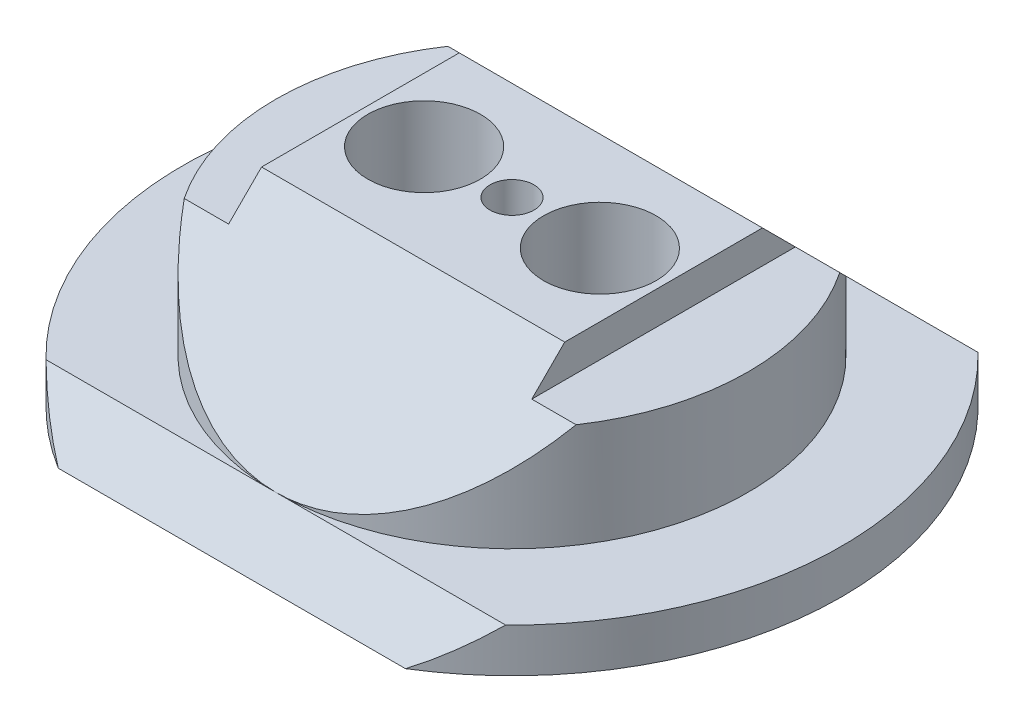
ISO-10303-21;
HEADER;
FILE_DESCRIPTION(('STEP AP214'),'2;1');
FILE_NAME('part.step','',(''),(''),'','','');
FILE_SCHEMA(('AUTOMOTIVE_DESIGN { 1 0 10303 214 1 1 1 1 }'));
ENDSEC;
DATA;
#1=APPLICATION_CONTEXT('core data for automotive mechanical design processes');
#2=APPLICATION_PROTOCOL_DEFINITION('international standard','automotive_design',2000,#1);
#3=PRODUCT_CONTEXT('',#1,'mechanical');
#4=PRODUCT('Part','Part','',(#3));
#5=PRODUCT_RELATED_PRODUCT_CATEGORY('part','',(#4));
#6=PRODUCT_DEFINITION_FORMATION('','',#4);
#7=PRODUCT_DEFINITION_CONTEXT('part definition',#1,'design');
#8=PRODUCT_DEFINITION('design','',#6,#7);
#9=PRODUCT_DEFINITION_SHAPE('','',#8);
#10=(LENGTH_UNIT() NAMED_UNIT(*) SI_UNIT(.MILLI.,.METRE.));
#11=(NAMED_UNIT(*) PLANE_ANGLE_UNIT() SI_UNIT($,.RADIAN.));
#12=(NAMED_UNIT(*) SI_UNIT($,.STERADIAN.) SOLID_ANGLE_UNIT());
#13=UNCERTAINTY_MEASURE_WITH_UNIT(LENGTH_MEASURE(1.E-05),#10,'distance_accuracy_value','');
#14=(GEOMETRIC_REPRESENTATION_CONTEXT(3) GLOBAL_UNCERTAINTY_ASSIGNED_CONTEXT((#13)) GLOBAL_UNIT_ASSIGNED_CONTEXT((#10,
#11,#12)) REPRESENTATION_CONTEXT('',''));
#15=CARTESIAN_POINT('',(0.,0.,0.));
#16=DIRECTION('',(0.,0.,1.));
#17=DIRECTION('',(1.,0.,0.));
#18=AXIS2_PLACEMENT_3D('',#15,#16,#17);
#19=CARTESIAN_POINT('',(0.,20.,0.));
#20=DIRECTION('',(0.,-1.,0.));
#21=DIRECTION('',(0.,0.,-1.));
#22=AXIS2_PLACEMENT_3D('',#19,#20,#21);
#23=CYLINDRICAL_SURFACE('',#22,1.375);
#24=CARTESIAN_POINT('',(0.,0.,0.));
#25=DIRECTION('',(0.,-1.,0.));
#26=DIRECTION('',(0.,0.,-1.));
#27=AXIS2_PLACEMENT_3D('',#24,#25,#26);
#28=CIRCLE('',#27,1.375);
#29=CARTESIAN_POINT('',(0.,0.,-1.375));
#30=VERTEX_POINT('',#29);
#31=EDGE_CURVE('E159',#30,#30,#28,.T.);
#32=ORIENTED_EDGE('',*,*,#31,.T.);
#33=EDGE_LOOP('',(#32));
#34=FACE_BOUND('',#33,.T.);
#35=CARTESIAN_POINT('',(0.,10.5,0.));
#36=DIRECTION('',(0.,1.,0.));
#37=DIRECTION('',(0.,0.,1.));
#38=AXIS2_PLACEMENT_3D('',#35,#36,#37);
#39=CIRCLE('',#38,1.375);
#40=CARTESIAN_POINT('',(0.,10.5,1.375));
#41=VERTEX_POINT('',#40);
#42=EDGE_CURVE('E63',#41,#41,#39,.F.);
#43=ORIENTED_EDGE('',*,*,#42,.F.);
#44=EDGE_LOOP('',(#43));
#45=FACE_BOUND('',#44,.T.);
#46=ADVANCED_FACE('F59',(#34,#45),#23,.F.);
#47=CARTESIAN_POINT('',(0.,0.,0.));
#48=DIRECTION('',(0.,1.,0.));
#49=DIRECTION('',(0.,0.,1.));
#50=AXIS2_PLACEMENT_3D('',#47,#48,#49);
#51=PLANE('',#50);
#52=CARTESIAN_POINT('',(-14.,0.,12.));
#53=DIRECTION('',(0.,-1.,0.));
#54=DIRECTION('',(0.,0.,-1.));
#55=AXIS2_PLACEMENT_3D('',#52,#53,#54);
#56=CIRCLE('',#55,5.);
#57=CARTESIAN_POINT('',(-14.,0.,7.));
#58=VERTEX_POINT('',#57);
#59=EDGE_CURVE('E628',#58,#58,#56,.T.);
#60=ORIENTED_EDGE('',*,*,#59,.F.);
#61=EDGE_LOOP('',(#60));
#62=FACE_BOUND('',#61,.T.);
#63=CARTESIAN_POINT('',(22.,0.,0.));
#64=DIRECTION('',(0.,-1.,0.));
#65=DIRECTION('',(0.,0.,-1.));
#66=AXIS2_PLACEMENT_3D('',#63,#64,#65);
#67=CIRCLE('',#66,5.);
#68=CARTESIAN_POINT('',(22.,0.,-5.));
#69=VERTEX_POINT('',#68);
#70=EDGE_CURVE('E627',#69,#69,#67,.T.);
#71=ORIENTED_EDGE('',*,*,#70,.F.);
#72=EDGE_LOOP('',(#71));
#73=FACE_BOUND('',#72,.T.);
#74=CARTESIAN_POINT('',(-22.,0.,0.));
#75=DIRECTION('',(0.,-1.,0.));
#76=DIRECTION('',(0.,0.,-1.));
#77=AXIS2_PLACEMENT_3D('',#74,#75,#76);
#78=CIRCLE('',#77,5.);
#79=CARTESIAN_POINT('',(-22.,0.,-5.));
#80=VERTEX_POINT('',#79);
#81=EDGE_CURVE('E653',#80,#80,#78,.T.);
#82=ORIENTED_EDGE('',*,*,#81,.F.);
#83=EDGE_LOOP('',(#82));
#84=FACE_BOUND('',#83,.T.);
#85=CARTESIAN_POINT('',(0.,0.,15.));
#86=DIRECTION('',(0.,-1.,0.));
#87=DIRECTION('',(0.,0.,-1.));
#88=AXIS2_PLACEMENT_3D('',#85,#86,#87);
#89=CIRCLE('',#88,5.);
#90=CARTESIAN_POINT('',(0.,0.,10.));
#91=VERTEX_POINT('',#90);
#92=EDGE_CURVE('E645',#91,#91,#89,.T.);
#93=ORIENTED_EDGE('',*,*,#92,.F.);
#94=EDGE_LOOP('',(#93));
#95=FACE_BOUND('',#94,.T.);
#96=CARTESIAN_POINT('',(14.,0.,-12.));
#97=DIRECTION('',(0.,-1.,0.));
#98=DIRECTION('',(0.,0.,-1.));
#99=AXIS2_PLACEMENT_3D('',#96,#97,#98);
#100=CIRCLE('',#99,5.);
#101=CARTESIAN_POINT('',(14.,0.,-17.));
#102=VERTEX_POINT('',#101);
#103=EDGE_CURVE('E700',#102,#102,#100,.T.);
#104=ORIENTED_EDGE('',*,*,#103,.F.);
#105=EDGE_LOOP('',(#104));
#106=FACE_BOUND('',#105,.T.);
#107=CARTESIAN_POINT('',(-14.,0.,-12.));
#108=DIRECTION('',(0.,-1.,0.));
#109=DIRECTION('',(0.,0.,-1.));
#110=AXIS2_PLACEMENT_3D('',#107,#108,#109);
#111=CIRCLE('',#110,5.);
#112=CARTESIAN_POINT('',(-14.,0.,-17.));
#113=VERTEX_POINT('',#112);
#114=EDGE_CURVE('E684',#113,#113,#111,.T.);
#115=ORIENTED_EDGE('',*,*,#114,.F.);
#116=EDGE_LOOP('',(#115));
#117=FACE_BOUND('',#116,.T.);
#118=CARTESIAN_POINT('',(14.,0.,12.));
#119=DIRECTION('',(0.,-1.,0.));
#120=DIRECTION('',(0.,0.,-1.));
#121=AXIS2_PLACEMENT_3D('',#118,#119,#120);
#122=CIRCLE('',#121,5.);
#123=CARTESIAN_POINT('',(14.,0.,7.));
#124=VERTEX_POINT('',#123);
#125=EDGE_CURVE('E693',#124,#124,#122,.T.);
#126=ORIENTED_EDGE('',*,*,#125,.F.);
#127=EDGE_LOOP('',(#126));
#128=FACE_BOUND('',#127,.T.);
#129=CARTESIAN_POINT('',(0.,0.,-15.));
#130=DIRECTION('',(0.,-1.,0.));
#131=DIRECTION('',(0.,0.,-1.));
#132=AXIS2_PLACEMENT_3D('',#129,#130,#131);
#133=CIRCLE('',#132,5.);
#134=CARTESIAN_POINT('',(0.,0.,-20.));
#135=VERTEX_POINT('',#134);
#136=EDGE_CURVE('E644',#135,#135,#133,.T.);
#137=ORIENTED_EDGE('',*,*,#136,.F.);
#138=EDGE_LOOP('',(#137));
#139=FACE_BOUND('',#138,.T.);
#140=ORIENTED_EDGE('',*,*,#31,.F.);
#141=EDGE_LOOP('',(#140));
#142=FACE_BOUND('',#141,.T.);
#143=CARTESIAN_POINT('',(-8.,0.,0.));
#144=DIRECTION('',(0.,1.,0.));
#145=DIRECTION('',(0.,0.,1.));
#146=AXIS2_PLACEMENT_3D('',#143,#144,#145);
#147=CIRCLE('',#146,5.125);
#148=CARTESIAN_POINT('',(-8.,0.,5.125));
#149=VERTEX_POINT('',#148);
#150=EDGE_CURVE('E199',#149,#149,#147,.T.);
#151=ORIENTED_EDGE('',*,*,#150,.T.);
#152=EDGE_LOOP('',(#151));
#153=FACE_BOUND('',#152,.T.);
#154=CARTESIAN_POINT('',(8.,0.,0.));
#155=DIRECTION('',(0.,1.,0.));
#156=DIRECTION('',(0.,0.,1.));
#157=AXIS2_PLACEMENT_3D('',#154,#155,#156);
#158=CIRCLE('',#157,5.125);
#159=CARTESIAN_POINT('',(8.,0.,5.125));
#160=VERTEX_POINT('',#159);
#161=EDGE_CURVE('E192',#160,#160,#158,.T.);
#162=ORIENTED_EDGE('',*,*,#161,.T.);
#163=EDGE_LOOP('',(#162));
#164=FACE_BOUND('',#163,.T.);
#165=DIRECTION('',(1.,0.,0.));
#166=VECTOR('',#165,1.);
#167=CARTESIAN_POINT('',(0.,0.,25.5));
#168=LINE('',#167,#166);
#169=CARTESIAN_POINT('',(-15.8034806292791,0.,25.5));
#170=VERTEX_POINT('',#169);
#171=CARTESIAN_POINT('',(15.8034806292791,0.,25.5));
#172=VERTEX_POINT('',#171);
#173=EDGE_CURVE('E222',#170,#172,#168,.T.);
#174=ORIENTED_EDGE('',*,*,#173,.F.);
#175=CARTESIAN_POINT('',(0.,0.,0.));
#176=DIRECTION('',(0.,1.,0.));
#177=DIRECTION('',(0.,0.,1.));
#178=AXIS2_PLACEMENT_3D('',#175,#176,#177);
#179=CIRCLE('',#178,30.);
#180=CARTESIAN_POINT('',(-15.8034806292789,0.,-25.5000000000001));
#181=VERTEX_POINT('',#180);
#182=EDGE_CURVE('E252',#181,#170,#179,.T.);
#183=ORIENTED_EDGE('',*,*,#182,.F.);
#184=DIRECTION('',(-1.,0.,0.));
#185=VECTOR('',#184,1.);
#186=CARTESIAN_POINT('',(0.,0.,-25.5000000000001));
#187=LINE('',#186,#185);
#188=CARTESIAN_POINT('',(15.8034806292789,0.,-25.5000000000001));
#189=VERTEX_POINT('',#188);
#190=EDGE_CURVE('E226',#189,#181,#187,.T.);
#191=ORIENTED_EDGE('',*,*,#190,.F.);
#192=EDGE_CURVE('E241',#172,#189,#179,.T.);
#193=ORIENTED_EDGE('',*,*,#192,.F.);
#194=EDGE_LOOP('',(#174,#183,#191,#193));
#195=FACE_BOUND('',#194,.T.);
#196=ADVANCED_FACE('F309',(#62,#73,#84,#95,#106,#117,#128,#139,#142,#153,#164,#195),#51,.F.);
#197=CARTESIAN_POINT('',(0.,4.,0.));
#198=DIRECTION('',(0.,-1.,0.));
#199=DIRECTION('',(0.,0.,-1.));
#200=AXIS2_PLACEMENT_3D('',#197,#198,#199);
#201=CYLINDRICAL_SURFACE('',#200,30.);
#202=CARTESIAN_POINT('',(0.,4.,0.));
#203=DIRECTION('',(0.,1.,0.));
#204=DIRECTION('',(0.,0.,1.));
#205=AXIS2_PLACEMENT_3D('',#202,#203,#204);
#206=CIRCLE('',#205,30.);
#207=CARTESIAN_POINT('',(20.9224759529077,4.,21.5));
#208=VERTEX_POINT('',#207);
#209=CARTESIAN_POINT('',(20.9224759529077,4.,-21.5));
#210=VERTEX_POINT('',#209);
#211=EDGE_CURVE('E215',#208,#210,#206,.T.);
#212=ORIENTED_EDGE('',*,*,#211,.F.);
#213=CARTESIAN_POINT('',(0.,25.4999999999998,0.));
#214=DIRECTION('',(0.,-0.707106781186551,-0.707106781186544));
#215=DIRECTION('',(0.,-0.707106781186544,0.707106781186551));
#216=AXIS2_PLACEMENT_3D('',#213,#214,#215);
#217=ELLIPSE('',#216,42.4264068711926,30.);
#218=EDGE_CURVE('E242',#172,#208,#217,.F.);
#219=ORIENTED_EDGE('',*,*,#218,.F.);
#220=ORIENTED_EDGE('',*,*,#192,.T.);
#221=CARTESIAN_POINT('',(0.,25.4999999999995,0.));
#222=DIRECTION('',(0.,-0.707106781186556,0.707106781186539));
#223=DIRECTION('',(0.,-0.707106781186539,-0.707106781186556));
#224=AXIS2_PLACEMENT_3D('',#221,#222,#223);
#225=ELLIPSE('',#224,42.4264068711924,30.);
#226=EDGE_CURVE('E238',#210,#189,#225,.F.);
#227=ORIENTED_EDGE('',*,*,#226,.F.);
#228=EDGE_LOOP('',(#212,#219,#220,#227));
#229=FACE_BOUND('',#228,.T.);
#230=ADVANCED_FACE('F61',(#229),#201,.T.);
#231=CARTESIAN_POINT('',(0.,4.,0.));
#232=DIRECTION('',(0.,1.,0.));
#233=DIRECTION('',(0.,0.,1.));
#234=AXIS2_PLACEMENT_3D('',#231,#232,#233);
#235=CIRCLE('',#234,30.);
#236=CARTESIAN_POINT('',(-20.9224759529077,4.,-21.5));
#237=VERTEX_POINT('',#236);
#238=CARTESIAN_POINT('',(-20.9224759529077,4.,21.5));
#239=VERTEX_POINT('',#238);
#240=EDGE_CURVE('E212',#237,#239,#235,.T.);
#241=ORIENTED_EDGE('',*,*,#240,.F.);
#242=CARTESIAN_POINT('',(0.,25.4999999999995,0.));
#243=DIRECTION('',(0.,0.707106781186556,-0.707106781186539));
#244=DIRECTION('',(0.,-0.707106781186539,-0.707106781186556));
#245=AXIS2_PLACEMENT_3D('',#242,#243,#244);
#246=ELLIPSE('',#245,42.4264068711924,30.);
#247=EDGE_CURVE('E230',#237,#181,#246,.F.);
#248=ORIENTED_EDGE('',*,*,#247,.T.);
#249=ORIENTED_EDGE('',*,*,#182,.T.);
#250=CARTESIAN_POINT('',(0.,25.4999999999998,0.));
#251=DIRECTION('',(0.,0.707106781186551,0.707106781186544));
#252=DIRECTION('',(0.,-0.707106781186544,0.707106781186551));
#253=AXIS2_PLACEMENT_3D('',#250,#251,#252);
#254=ELLIPSE('',#253,42.4264068711926,30.);
#255=EDGE_CURVE('E233',#170,#239,#254,.F.);
#256=ORIENTED_EDGE('',*,*,#255,.T.);
#257=EDGE_LOOP('',(#241,#248,#249,#256));
#258=FACE_BOUND('',#257,.T.);
#259=ADVANCED_FACE('F318',(#258),#201,.T.);
#260=CARTESIAN_POINT('',(30.001,16.5,8.99999999999987));
#261=DIRECTION('',(0.,-0.707106781186551,-0.707106781186544));
#262=DIRECTION('',(0.,0.707106781186544,-0.707106781186551));
#263=AXIS2_PLACEMENT_3D('',#260,#261,#262);
#264=PLANE('',#263);
#265=DIRECTION('',(1.,0.,0.));
#266=VECTOR('',#265,1.);
#267=CARTESIAN_POINT('',(30.001,4.,21.5));
#268=LINE('',#267,#266);
#269=CARTESIAN_POINT('',(0.,3.99999999999999,21.5));
#270=VERTEX_POINT('',#269);
#271=EDGE_CURVE('E221',#239,#270,#268,.T.);
#272=ORIENTED_EDGE('',*,*,#271,.F.);
#273=ORIENTED_EDGE('',*,*,#255,.F.);
#274=ORIENTED_EDGE('',*,*,#173,.T.);
#275=ORIENTED_EDGE('',*,*,#218,.T.);
#276=EDGE_CURVE('E218',#270,#208,#268,.T.);
#277=ORIENTED_EDGE('',*,*,#276,.F.);
#278=EDGE_LOOP('',(#272,#273,#274,#275,#277));
#279=FACE_BOUND('',#278,.T.);
#280=ADVANCED_FACE('F301',(#279),#264,.F.);
#281=CARTESIAN_POINT('',(30.001,16.5,-8.99999999999971));
#282=DIRECTION('',(0.,-0.707106781186556,0.707106781186539));
#283=DIRECTION('',(0.,-0.707106781186539,-0.707106781186556));
#284=AXIS2_PLACEMENT_3D('',#281,#282,#283);
#285=PLANE('',#284);
#286=DIRECTION('',(-1.,0.,0.));
#287=VECTOR('',#286,1.);
#288=CARTESIAN_POINT('',(30.001,4.,-21.5));
#289=LINE('',#288,#287);
#290=CARTESIAN_POINT('',(0.,4.,-21.5));
#291=VERTEX_POINT('',#290);
#292=EDGE_CURVE('E262',#210,#291,#289,.T.);
#293=ORIENTED_EDGE('',*,*,#292,.F.);
#294=ORIENTED_EDGE('',*,*,#226,.T.);
#295=ORIENTED_EDGE('',*,*,#190,.T.);
#296=ORIENTED_EDGE('',*,*,#247,.F.);
#297=EDGE_CURVE('E259',#291,#237,#289,.T.);
#298=ORIENTED_EDGE('',*,*,#297,.F.);
#299=EDGE_LOOP('',(#293,#294,#295,#296,#298));
#300=FACE_BOUND('',#299,.T.);
#301=ADVANCED_FACE('F316',(#300),#285,.F.);
#302=CARTESIAN_POINT('',(0.,96.0338927753446,0.));
#303=DIRECTION('',(0.,-1.,0.));
#304=DIRECTION('',(0.,0.,-1.));
#305=AXIS2_PLACEMENT_3D('',#302,#303,#304);
#306=CYLINDRICAL_SURFACE('',#305,21.5);
#307=CARTESIAN_POINT('',(0.,13.5,0.));
#308=DIRECTION('',(0.,-1.,0.));
#309=DIRECTION('',(1.,0.,0.));
#310=AXIS2_PLACEMENT_3D('',#307,#308,#309);
#311=CIRCLE('',#310,21.5);
#312=CARTESIAN_POINT('',(17.8395627749114,13.5,-11.9999999999998));
#313=VERTEX_POINT('',#312);
#314=CARTESIAN_POINT('',(17.8395627749114,13.5,11.9999999999999));
#315=VERTEX_POINT('',#314);
#316=EDGE_CURVE('E180',#313,#315,#311,.T.);
#317=ORIENTED_EDGE('',*,*,#316,.T.);
#318=CARTESIAN_POINT('',(0.,25.4999999999998,0.));
#319=DIRECTION('',(0.,-0.707106781186551,-0.707106781186544));
#320=DIRECTION('',(0.,-0.707106781186544,0.707106781186551));
#321=AXIS2_PLACEMENT_3D('',#318,#319,#320);
#322=ELLIPSE('',#321,30.4055915910214,21.5);
#323=EDGE_CURVE('E211',#270,#315,#322,.F.);
#324=ORIENTED_EDGE('',*,*,#323,.F.);
#325=CARTESIAN_POINT('',(0.,4.,0.));
#326=DIRECTION('',(0.,1.,0.));
#327=DIRECTION('',(0.,0.,1.));
#328=AXIS2_PLACEMENT_3D('',#325,#326,#327);
#329=CIRCLE('',#328,21.5);
#330=EDGE_CURVE('E204',#270,#291,#329,.T.);
#331=ORIENTED_EDGE('',*,*,#330,.T.);
#332=CARTESIAN_POINT('',(0.,25.4999999999995,0.));
#333=DIRECTION('',(0.,-0.707106781186556,0.707106781186539));
#334=DIRECTION('',(0.,-0.707106781186539,-0.707106781186556));
#335=AXIS2_PLACEMENT_3D('',#332,#333,#334);
#336=ELLIPSE('',#335,30.4055915910212,21.5);
#337=EDGE_CURVE('E256',#313,#291,#336,.F.);
#338=ORIENTED_EDGE('',*,*,#337,.F.);
#339=EDGE_LOOP('',(#317,#324,#331,#338));
#340=FACE_BOUND('',#339,.T.);
#341=ADVANCED_FACE('F292',(#340),#306,.T.);
#342=CARTESIAN_POINT('',(0.,4.,0.));
#343=DIRECTION('',(0.,1.,0.));
#344=DIRECTION('',(0.,0.,1.));
#345=AXIS2_PLACEMENT_3D('',#342,#343,#344);
#346=PLANE('',#345);
#347=ORIENTED_EDGE('',*,*,#276,.T.);
#348=ORIENTED_EDGE('',*,*,#211,.T.);
#349=ORIENTED_EDGE('',*,*,#292,.T.);
#350=ORIENTED_EDGE('',*,*,#330,.F.);
#351=EDGE_LOOP('',(#347,#348,#349,#350));
#352=FACE_BOUND('',#351,.T.);
#353=ADVANCED_FACE('F298',(#352),#346,.T.);
#354=ORIENTED_EDGE('',*,*,#271,.T.);
#355=EDGE_CURVE('E203',#291,#270,#329,.T.);
#356=ORIENTED_EDGE('',*,*,#355,.F.);
#357=ORIENTED_EDGE('',*,*,#297,.T.);
#358=ORIENTED_EDGE('',*,*,#240,.T.);
#359=EDGE_LOOP('',(#354,#356,#357,#358));
#360=FACE_BOUND('',#359,.T.);
#361=ADVANCED_FACE('F285',(#360),#346,.T.);
#362=CARTESIAN_POINT('',(-17.8395627749113,13.5,11.9999999999999));
#363=VERTEX_POINT('',#362);
#364=EDGE_CURVE('E208',#363,#270,#322,.F.);
#365=ORIENTED_EDGE('',*,*,#364,.F.);
#366=CARTESIAN_POINT('',(0.,13.5,0.));
#367=DIRECTION('',(0.,-1.,0.));
#368=DIRECTION('',(0.,0.,-1.));
#369=AXIS2_PLACEMENT_3D('',#366,#367,#368);
#370=CIRCLE('',#369,21.5);
#371=CARTESIAN_POINT('',(-17.8395627749114,13.5,-11.9999999999998));
#372=VERTEX_POINT('',#371);
#373=EDGE_CURVE('E76',#363,#372,#370,.T.);
#374=ORIENTED_EDGE('',*,*,#373,.T.);
#375=EDGE_CURVE('E164',#291,#372,#336,.F.);
#376=ORIENTED_EDGE('',*,*,#375,.F.);
#377=ORIENTED_EDGE('',*,*,#355,.T.);
#378=EDGE_LOOP('',(#365,#374,#376,#377));
#379=FACE_BOUND('',#378,.T.);
#380=ADVANCED_FACE('F277',(#379),#306,.T.);
#381=DIRECTION('',(1.,0.,0.));
#382=VECTOR('',#381,1.);
#383=CARTESIAN_POINT('',(30.001,13.5,-11.9999999999998));
#384=LINE('',#383,#382);
#385=CARTESIAN_POINT('',(-13.8,13.5,-11.9999999999998));
#386=VERTEX_POINT('',#385);
#387=EDGE_CURVE('E155',#372,#386,#384,.T.);
#388=ORIENTED_EDGE('',*,*,#387,.T.);
#389=DIRECTION('',(0.,0.707106781186539,0.707106781186556));
#390=VECTOR('',#389,1.);
#391=CARTESIAN_POINT('',(-13.8,16.5,-8.99999999999971));
#392=LINE('',#391,#390);
#393=CARTESIAN_POINT('',(-13.8,16.5,-8.99999999999971));
#394=VERTEX_POINT('',#393);
#395=EDGE_CURVE('E144',#386,#394,#392,.T.);
#396=ORIENTED_EDGE('',*,*,#395,.T.);
#397=DIRECTION('',(-1.,0.,0.));
#398=VECTOR('',#397,1.);
#399=CARTESIAN_POINT('',(30.001,16.5,-8.99999999999971));
#400=LINE('',#399,#398);
#401=CARTESIAN_POINT('',(13.8,16.5,-8.99999999999971));
#402=VERTEX_POINT('',#401);
#403=EDGE_CURVE('E246',#402,#394,#400,.T.);
#404=ORIENTED_EDGE('',*,*,#403,.F.);
#405=DIRECTION('',(0.,-0.707106781186539,-0.707106781186556));
#406=VECTOR('',#405,1.);
#407=CARTESIAN_POINT('',(13.8,16.5,-8.99999999999971));
#408=LINE('',#407,#406);
#409=CARTESIAN_POINT('',(13.8,13.5,-11.9999999999998));
#410=VERTEX_POINT('',#409);
#411=EDGE_CURVE('E174',#402,#410,#408,.T.);
#412=ORIENTED_EDGE('',*,*,#411,.T.);
#413=DIRECTION('',(1.,0.,0.));
#414=VECTOR('',#413,1.);
#415=CARTESIAN_POINT('',(30.001,13.5,-11.9999999999998));
#416=LINE('',#415,#414);
#417=EDGE_CURVE('E183',#410,#313,#416,.T.);
#418=ORIENTED_EDGE('',*,*,#417,.T.);
#419=ORIENTED_EDGE('',*,*,#337,.T.);
#420=ORIENTED_EDGE('',*,*,#375,.T.);
#421=EDGE_LOOP('',(#388,#396,#404,#412,#418,#419,#420));
#422=FACE_BOUND('',#421,.T.);
#423=ADVANCED_FACE('F162',(#422),#285,.F.);
#424=CARTESIAN_POINT('',(30.001,16.5,8.99999999999987));
#425=DIRECTION('',(0.,-1.,0.));
#426=DIRECTION('',(0.,0.,-1.));
#427=AXIS2_PLACEMENT_3D('',#424,#425,#426);
#428=PLANE('',#427);
#429=CARTESIAN_POINT('',(0.,16.5,0.));
#430=DIRECTION('',(0.,1.,0.));
#431=DIRECTION('',(0.,0.,1.));
#432=AXIS2_PLACEMENT_3D('',#429,#430,#431);
#433=CIRCLE('',#432,2.);
#434=CARTESIAN_POINT('',(0.,16.5,2.00000000000001));
#435=VERTEX_POINT('',#434);
#436=EDGE_CURVE('E661',#435,#435,#433,.T.);
#437=ORIENTED_EDGE('',*,*,#436,.F.);
#438=EDGE_LOOP('',(#437));
#439=FACE_BOUND('',#438,.T.);
#440=CARTESIAN_POINT('',(-8.,16.5,0.));
#441=DIRECTION('',(0.,1.,0.));
#442=DIRECTION('',(0.,0.,1.));
#443=AXIS2_PLACEMENT_3D('',#440,#441,#442);
#444=CIRCLE('',#443,5.125);
#445=CARTESIAN_POINT('',(-8.,16.5,5.12500000000001));
#446=VERTEX_POINT('',#445);
#447=EDGE_CURVE('E188',#446,#446,#444,.T.);
#448=ORIENTED_EDGE('',*,*,#447,.F.);
#449=EDGE_LOOP('',(#448));
#450=FACE_BOUND('',#449,.T.);
#451=CARTESIAN_POINT('',(8.,16.5,0.));
#452=DIRECTION('',(0.,1.,0.));
#453=DIRECTION('',(0.,0.,1.));
#454=AXIS2_PLACEMENT_3D('',#451,#452,#453);
#455=CIRCLE('',#454,5.125);
#456=CARTESIAN_POINT('',(8.,16.5,5.12500000000001));
#457=VERTEX_POINT('',#456);
#458=EDGE_CURVE('E187',#457,#457,#455,.T.);
#459=ORIENTED_EDGE('',*,*,#458,.F.);
#460=EDGE_LOOP('',(#459));
#461=FACE_BOUND('',#460,.T.);
#462=ORIENTED_EDGE('',*,*,#403,.T.);
#463=DIRECTION('',(0.,0.,1.));
#464=VECTOR('',#463,1.);
#465=CARTESIAN_POINT('',(-13.8,16.5,-25.5000000000001));
#466=LINE('',#465,#464);
#467=CARTESIAN_POINT('',(-13.8,16.5,8.99999999999986));
#468=VERTEX_POINT('',#467);
#469=EDGE_CURVE('E149',#394,#468,#466,.T.);
#470=ORIENTED_EDGE('',*,*,#469,.T.);
#471=DIRECTION('',(-1.,0.,0.));
#472=VECTOR('',#471,1.);
#473=CARTESIAN_POINT('',(30.001,16.5,8.99999999999987));
#474=LINE('',#473,#472);
#475=CARTESIAN_POINT('',(13.8,16.5,8.99999999999987));
#476=VERTEX_POINT('',#475);
#477=EDGE_CURVE('E237',#476,#468,#474,.T.);
#478=ORIENTED_EDGE('',*,*,#477,.F.);
#479=DIRECTION('',(0.,0.,1.));
#480=VECTOR('',#479,1.);
#481=CARTESIAN_POINT('',(13.8,16.5,-25.5000000000001));
#482=LINE('',#481,#480);
#483=EDGE_CURVE('E84',#402,#476,#482,.T.);
#484=ORIENTED_EDGE('',*,*,#483,.F.);
#485=EDGE_LOOP('',(#462,#470,#478,#484));
#486=FACE_BOUND('',#485,.T.);
#487=ADVANCED_FACE('F363',(#439,#450,#461,#486),#428,.F.);
#488=ORIENTED_EDGE('',*,*,#477,.T.);
#489=DIRECTION('',(0.,-0.707106781186544,0.707106781186551));
#490=VECTOR('',#489,1.);
#491=CARTESIAN_POINT('',(-13.8,16.5,8.99999999999987));
#492=LINE('',#491,#490);
#493=CARTESIAN_POINT('',(-13.8,13.5,11.9999999999999));
#494=VERTEX_POINT('',#493);
#495=EDGE_CURVE('E13',#468,#494,#492,.T.);
#496=ORIENTED_EDGE('',*,*,#495,.T.);
#497=DIRECTION('',(-1.,0.,0.));
#498=VECTOR('',#497,1.);
#499=CARTESIAN_POINT('',(30.001,13.5,11.9999999999999));
#500=LINE('',#499,#498);
#501=EDGE_CURVE('E69',#494,#363,#500,.T.);
#502=ORIENTED_EDGE('',*,*,#501,.T.);
#503=ORIENTED_EDGE('',*,*,#364,.T.);
#504=ORIENTED_EDGE('',*,*,#323,.T.);
#505=DIRECTION('',(-1.,0.,0.));
#506=VECTOR('',#505,1.);
#507=CARTESIAN_POINT('',(30.001,13.5,11.9999999999999));
#508=LINE('',#507,#506);
#509=CARTESIAN_POINT('',(13.8,13.5,11.9999999999999));
#510=VERTEX_POINT('',#509);
#511=EDGE_CURVE('E266',#315,#510,#508,.T.);
#512=ORIENTED_EDGE('',*,*,#511,.T.);
#513=DIRECTION('',(0.,0.707106781186544,-0.707106781186551));
#514=VECTOR('',#513,1.);
#515=CARTESIAN_POINT('',(13.8,16.5,8.99999999999987));
#516=LINE('',#515,#514);
#517=EDGE_CURVE('E263',#510,#476,#516,.T.);
#518=ORIENTED_EDGE('',*,*,#517,.T.);
#519=EDGE_LOOP('',(#488,#496,#502,#503,#504,#512,#518));
#520=FACE_BOUND('',#519,.T.);
#521=ADVANCED_FACE('F273',(#520),#264,.F.);
#522=CARTESIAN_POINT('',(8.,-7.50000000000001,0.));
#523=DIRECTION('',(0.,1.,0.));
#524=DIRECTION('',(0.,0.,1.));
#525=AXIS2_PLACEMENT_3D('',#522,#523,#524);
#526=CYLINDRICAL_SURFACE('',#525,5.125);
#527=ORIENTED_EDGE('',*,*,#458,.T.);
#528=EDGE_LOOP('',(#527));
#529=FACE_BOUND('',#528,.T.);
#530=ORIENTED_EDGE('',*,*,#161,.F.);
#531=EDGE_LOOP('',(#530));
#532=FACE_BOUND('',#531,.T.);
#533=ADVANCED_FACE('F353',(#529,#532),#526,.F.);
#534=CARTESIAN_POINT('',(-8.,-7.50000000000001,0.));
#535=DIRECTION('',(0.,1.,0.));
#536=DIRECTION('',(0.,0.,1.));
#537=AXIS2_PLACEMENT_3D('',#534,#535,#536);
#538=CYLINDRICAL_SURFACE('',#537,5.125);
#539=ORIENTED_EDGE('',*,*,#447,.T.);
#540=EDGE_LOOP('',(#539));
#541=FACE_BOUND('',#540,.T.);
#542=ORIENTED_EDGE('',*,*,#150,.F.);
#543=EDGE_LOOP('',(#542));
#544=FACE_BOUND('',#543,.T.);
#545=ADVANCED_FACE('F347',(#541,#544),#538,.F.);
#546=CARTESIAN_POINT('',(21.5,13.5,-25.5000000000001));
#547=DIRECTION('',(0.,-1.,0.));
#548=DIRECTION('',(1.,0.,0.));
#549=AXIS2_PLACEMENT_3D('',#546,#547,#548);
#550=PLANE('',#549);
#551=DIRECTION('',(0.,0.,1.));
#552=VECTOR('',#551,1.);
#553=CARTESIAN_POINT('',(13.8,13.5,-25.5000000000001));
#554=LINE('',#553,#552);
#555=EDGE_CURVE('E170',#410,#510,#554,.T.);
#556=ORIENTED_EDGE('',*,*,#555,.T.);
#557=ORIENTED_EDGE('',*,*,#511,.F.);
#558=ORIENTED_EDGE('',*,*,#316,.F.);
#559=ORIENTED_EDGE('',*,*,#417,.F.);
#560=EDGE_LOOP('',(#556,#557,#558,#559));
#561=FACE_BOUND('',#560,.T.);
#562=ADVANCED_FACE('F344',(#561),#550,.F.);
#563=CARTESIAN_POINT('',(13.8,13.5,-25.5000000000001));
#564=DIRECTION('',(-1.,0.,0.));
#565=DIRECTION('',(0.,0.,1.));
#566=AXIS2_PLACEMENT_3D('',#563,#564,#565);
#567=PLANE('',#566);
#568=ORIENTED_EDGE('',*,*,#483,.T.);
#569=ORIENTED_EDGE('',*,*,#517,.F.);
#570=ORIENTED_EDGE('',*,*,#555,.F.);
#571=ORIENTED_EDGE('',*,*,#411,.F.);
#572=EDGE_LOOP('',(#568,#569,#570,#571));
#573=FACE_BOUND('',#572,.T.);
#574=ADVANCED_FACE('F340',(#573),#567,.F.);
#575=CARTESIAN_POINT('',(-13.8,13.5,-25.5000000000001));
#576=DIRECTION('',(1.,0.,0.));
#577=DIRECTION('',(0.,0.,-1.));
#578=AXIS2_PLACEMENT_3D('',#575,#576,#577);
#579=PLANE('',#578);
#580=DIRECTION('',(0.,0.,1.));
#581=VECTOR('',#580,1.);
#582=CARTESIAN_POINT('',(-13.8,13.5,-25.5000000000001));
#583=LINE('',#582,#581);
#584=EDGE_CURVE('E147',#386,#494,#583,.T.);
#585=ORIENTED_EDGE('',*,*,#584,.T.);
#586=ORIENTED_EDGE('',*,*,#495,.F.);
#587=ORIENTED_EDGE('',*,*,#469,.F.);
#588=ORIENTED_EDGE('',*,*,#395,.F.);
#589=EDGE_LOOP('',(#585,#586,#587,#588));
#590=FACE_BOUND('',#589,.T.);
#591=ADVANCED_FACE('F146',(#590),#579,.F.);
#592=CARTESIAN_POINT('',(-21.5,13.5,-25.5000000000001));
#593=DIRECTION('',(0.,-1.,0.));
#594=DIRECTION('',(0.,0.,-1.));
#595=AXIS2_PLACEMENT_3D('',#592,#593,#594);
#596=PLANE('',#595);
#597=ORIENTED_EDGE('',*,*,#373,.F.);
#598=ORIENTED_EDGE('',*,*,#501,.F.);
#599=ORIENTED_EDGE('',*,*,#584,.F.);
#600=ORIENTED_EDGE('',*,*,#387,.F.);
#601=EDGE_LOOP('',(#597,#598,#599,#600));
#602=FACE_BOUND('',#601,.T.);
#603=ADVANCED_FACE('F157',(#602),#596,.F.);
#604=CARTESIAN_POINT('',(0.,10.5,0.));
#605=DIRECTION('',(0.,1.,0.));
#606=DIRECTION('',(0.,0.,1.));
#607=AXIS2_PLACEMENT_3D('',#604,#605,#606);
#608=PLANE('',#607);
#609=CARTESIAN_POINT('',(0.,10.5,0.));
#610=DIRECTION('',(0.,1.,0.));
#611=DIRECTION('',(0.,0.,1.));
#612=AXIS2_PLACEMENT_3D('',#609,#610,#611);
#613=CIRCLE('',#612,2.);
#614=CARTESIAN_POINT('',(0.,10.5,2.));
#615=VERTEX_POINT('',#614);
#616=EDGE_CURVE('E665',#615,#615,#613,.T.);
#617=ORIENTED_EDGE('',*,*,#616,.T.);
#618=EDGE_LOOP('',(#617));
#619=FACE_BOUND('',#618,.T.);
#620=ORIENTED_EDGE('',*,*,#42,.T.);
#621=EDGE_LOOP('',(#620));
#622=FACE_BOUND('',#621,.T.);
#623=ADVANCED_FACE('F343',(#619,#622),#608,.T.);
#624=CARTESIAN_POINT('',(0.,10.5,0.));
#625=DIRECTION('',(0.,1.,0.));
#626=DIRECTION('',(0.,0.,1.));
#627=AXIS2_PLACEMENT_3D('',#624,#625,#626);
#628=CYLINDRICAL_SURFACE('',#627,2.);
#629=ORIENTED_EDGE('',*,*,#616,.F.);
#630=EDGE_LOOP('',(#629));
#631=FACE_BOUND('',#630,.T.);
#632=ORIENTED_EDGE('',*,*,#436,.T.);
#633=EDGE_LOOP('',(#632));
#634=FACE_BOUND('',#633,.T.);
#635=ADVANCED_FACE('F336',(#631,#634),#628,.F.);
#636=CARTESIAN_POINT('',(0.,3.,-15.));
#637=DIRECTION('',(0.,-1.,0.));
#638=DIRECTION('',(0.,0.,-1.));
#639=AXIS2_PLACEMENT_3D('',#636,#637,#638);
#640=CYLINDRICAL_SURFACE('',#639,5.);
#641=CARTESIAN_POINT('',(0.,3.,-15.));
#642=DIRECTION('',(0.,-1.,0.));
#643=DIRECTION('',(0.,0.,-1.));
#644=AXIS2_PLACEMENT_3D('',#641,#642,#643);
#645=CIRCLE('',#644,5.);
#646=CARTESIAN_POINT('',(0.,3.,-20.));
#647=VERTEX_POINT('',#646);
#648=EDGE_CURVE('E657',#647,#647,#645,.T.);
#649=ORIENTED_EDGE('',*,*,#648,.F.);
#650=EDGE_LOOP('',(#649));
#651=FACE_BOUND('',#650,.T.);
#652=ORIENTED_EDGE('',*,*,#136,.T.);
#653=EDGE_LOOP('',(#652));
#654=FACE_BOUND('',#653,.T.);
#655=ADVANCED_FACE('F453',(#651,#654),#640,.F.);
#656=CARTESIAN_POINT('',(0.,3.,-15.));
#657=DIRECTION('',(0.,-1.,0.));
#658=DIRECTION('',(0.,0.,-1.));
#659=AXIS2_PLACEMENT_3D('',#656,#657,#658);
#660=PLANE('',#659);
#661=ORIENTED_EDGE('',*,*,#648,.T.);
#662=EDGE_LOOP('',(#661));
#663=FACE_BOUND('',#662,.T.);
#664=ADVANCED_FACE('F469',(#663),#660,.T.);
#665=CARTESIAN_POINT('',(14.,3.,12.));
#666=DIRECTION('',(0.,-1.,0.));
#667=DIRECTION('',(0.,0.,-1.));
#668=AXIS2_PLACEMENT_3D('',#665,#666,#667);
#669=CYLINDRICAL_SURFACE('',#668,5.);
#670=CARTESIAN_POINT('',(14.,3.,12.));
#671=DIRECTION('',(0.,-1.,0.));
#672=DIRECTION('',(0.,0.,-1.));
#673=AXIS2_PLACEMENT_3D('',#670,#671,#672);
#674=CIRCLE('',#673,5.);
#675=CARTESIAN_POINT('',(14.,3.,7.));
#676=VERTEX_POINT('',#675);
#677=EDGE_CURVE('E636',#676,#676,#674,.T.);
#678=ORIENTED_EDGE('',*,*,#677,.F.);
#679=EDGE_LOOP('',(#678));
#680=FACE_BOUND('',#679,.T.);
#681=ORIENTED_EDGE('',*,*,#125,.T.);
#682=EDGE_LOOP('',(#681));
#683=FACE_BOUND('',#682,.T.);
#684=ADVANCED_FACE('F479',(#680,#683),#669,.F.);
#685=CARTESIAN_POINT('',(14.,3.,12.));
#686=DIRECTION('',(0.,-1.,0.));
#687=DIRECTION('',(0.,0.,-1.));
#688=AXIS2_PLACEMENT_3D('',#685,#686,#687);
#689=PLANE('',#688);
#690=ORIENTED_EDGE('',*,*,#677,.T.);
#691=EDGE_LOOP('',(#690));
#692=FACE_BOUND('',#691,.T.);
#693=ADVANCED_FACE('F489',(#692),#689,.T.);
#694=CARTESIAN_POINT('',(-14.,3.,-12.));
#695=DIRECTION('',(0.,-1.,0.));
#696=DIRECTION('',(0.,0.,-1.));
#697=AXIS2_PLACEMENT_3D('',#694,#695,#696);
#698=CYLINDRICAL_SURFACE('',#697,5.);
#699=CARTESIAN_POINT('',(-14.,3.,-12.));
#700=DIRECTION('',(0.,-1.,0.));
#701=DIRECTION('',(0.,0.,-1.));
#702=AXIS2_PLACEMENT_3D('',#699,#700,#701);
#703=CIRCLE('',#702,5.);
#704=CARTESIAN_POINT('',(-14.,3.,-17.));
#705=VERTEX_POINT('',#704);
#706=EDGE_CURVE('E688',#705,#705,#703,.T.);
#707=ORIENTED_EDGE('',*,*,#706,.F.);
#708=EDGE_LOOP('',(#707));
#709=FACE_BOUND('',#708,.T.);
#710=ORIENTED_EDGE('',*,*,#114,.T.);
#711=EDGE_LOOP('',(#710));
#712=FACE_BOUND('',#711,.T.);
#713=ADVANCED_FACE('F499',(#709,#712),#698,.F.);
#714=CARTESIAN_POINT('',(-14.,3.,-12.));
#715=DIRECTION('',(0.,-1.,0.));
#716=DIRECTION('',(0.,0.,-1.));
#717=AXIS2_PLACEMENT_3D('',#714,#715,#716);
#718=PLANE('',#717);
#719=ORIENTED_EDGE('',*,*,#706,.T.);
#720=EDGE_LOOP('',(#719));
#721=FACE_BOUND('',#720,.T.);
#722=ADVANCED_FACE('F509',(#721),#718,.T.);
#723=CARTESIAN_POINT('',(14.,3.,-12.));
#724=DIRECTION('',(0.,-1.,0.));
#725=DIRECTION('',(0.,0.,-1.));
#726=AXIS2_PLACEMENT_3D('',#723,#724,#725);
#727=CYLINDRICAL_SURFACE('',#726,5.);
#728=CARTESIAN_POINT('',(14.,3.,-12.));
#729=DIRECTION('',(0.,-1.,0.));
#730=DIRECTION('',(0.,0.,-1.));
#731=AXIS2_PLACEMENT_3D('',#728,#729,#730);
#732=CIRCLE('',#731,5.);
#733=CARTESIAN_POINT('',(14.,3.,-17.));
#734=VERTEX_POINT('',#733);
#735=EDGE_CURVE('E689',#734,#734,#732,.T.);
#736=ORIENTED_EDGE('',*,*,#735,.F.);
#737=EDGE_LOOP('',(#736));
#738=FACE_BOUND('',#737,.T.);
#739=ORIENTED_EDGE('',*,*,#103,.T.);
#740=EDGE_LOOP('',(#739));
#741=FACE_BOUND('',#740,.T.);
#742=ADVANCED_FACE('F519',(#738,#741),#727,.F.);
#743=CARTESIAN_POINT('',(14.,3.,-12.));
#744=DIRECTION('',(0.,-1.,0.));
#745=DIRECTION('',(0.,0.,-1.));
#746=AXIS2_PLACEMENT_3D('',#743,#744,#745);
#747=PLANE('',#746);
#748=ORIENTED_EDGE('',*,*,#735,.T.);
#749=EDGE_LOOP('',(#748));
#750=FACE_BOUND('',#749,.T.);
#751=ADVANCED_FACE('F529',(#750),#747,.T.);
#752=CARTESIAN_POINT('',(0.,3.,15.));
#753=DIRECTION('',(0.,-1.,0.));
#754=DIRECTION('',(0.,0.,-1.));
#755=AXIS2_PLACEMENT_3D('',#752,#753,#754);
#756=CYLINDRICAL_SURFACE('',#755,5.);
#757=CARTESIAN_POINT('',(0.,3.,15.));
#758=DIRECTION('',(0.,-1.,0.));
#759=DIRECTION('',(0.,0.,-1.));
#760=AXIS2_PLACEMENT_3D('',#757,#758,#759);
#761=CIRCLE('',#760,5.);
#762=CARTESIAN_POINT('',(0.,3.,10.));
#763=VERTEX_POINT('',#762);
#764=EDGE_CURVE('E640',#763,#763,#761,.T.);
#765=ORIENTED_EDGE('',*,*,#764,.F.);
#766=EDGE_LOOP('',(#765));
#767=FACE_BOUND('',#766,.T.);
#768=ORIENTED_EDGE('',*,*,#92,.T.);
#769=EDGE_LOOP('',(#768));
#770=FACE_BOUND('',#769,.T.);
#771=ADVANCED_FACE('F539',(#767,#770),#756,.F.);
#772=CARTESIAN_POINT('',(0.,3.,15.));
#773=DIRECTION('',(0.,-1.,0.));
#774=DIRECTION('',(0.,0.,-1.));
#775=AXIS2_PLACEMENT_3D('',#772,#773,#774);
#776=PLANE('',#775);
#777=ORIENTED_EDGE('',*,*,#764,.T.);
#778=EDGE_LOOP('',(#777));
#779=FACE_BOUND('',#778,.T.);
#780=ADVANCED_FACE('F549',(#779),#776,.T.);
#781=CARTESIAN_POINT('',(-22.,3.,0.));
#782=DIRECTION('',(0.,-1.,0.));
#783=DIRECTION('',(0.,0.,-1.));
#784=AXIS2_PLACEMENT_3D('',#781,#782,#783);
#785=CYLINDRICAL_SURFACE('',#784,5.);
#786=CARTESIAN_POINT('',(-22.,3.,0.));
#787=DIRECTION('',(0.,-1.,0.));
#788=DIRECTION('',(0.,0.,-1.));
#789=AXIS2_PLACEMENT_3D('',#786,#787,#788);
#790=CIRCLE('',#789,5.);
#791=CARTESIAN_POINT('',(-22.,3.,-5.));
#792=VERTEX_POINT('',#791);
#793=EDGE_CURVE('E649',#792,#792,#790,.T.);
#794=ORIENTED_EDGE('',*,*,#793,.F.);
#795=EDGE_LOOP('',(#794));
#796=FACE_BOUND('',#795,.T.);
#797=ORIENTED_EDGE('',*,*,#81,.T.);
#798=EDGE_LOOP('',(#797));
#799=FACE_BOUND('',#798,.T.);
#800=ADVANCED_FACE('F559',(#796,#799),#785,.F.);
#801=CARTESIAN_POINT('',(-22.,3.,0.));
#802=DIRECTION('',(0.,-1.,0.));
#803=DIRECTION('',(0.,0.,-1.));
#804=AXIS2_PLACEMENT_3D('',#801,#802,#803);
#805=PLANE('',#804);
#806=ORIENTED_EDGE('',*,*,#793,.T.);
#807=EDGE_LOOP('',(#806));
#808=FACE_BOUND('',#807,.T.);
#809=ADVANCED_FACE('F569',(#808),#805,.T.);
#810=CARTESIAN_POINT('',(22.,3.,0.));
#811=DIRECTION('',(0.,-1.,0.));
#812=DIRECTION('',(0.,0.,-1.));
#813=AXIS2_PLACEMENT_3D('',#810,#811,#812);
#814=CYLINDRICAL_SURFACE('',#813,5.);
#815=CARTESIAN_POINT('',(22.,3.,0.));
#816=DIRECTION('',(0.,-1.,0.));
#817=DIRECTION('',(0.,0.,-1.));
#818=AXIS2_PLACEMENT_3D('',#815,#816,#817);
#819=CIRCLE('',#818,5.);
#820=CARTESIAN_POINT('',(22.,3.,-5.));
#821=VERTEX_POINT('',#820);
#822=EDGE_CURVE('E633',#821,#821,#819,.T.);
#823=ORIENTED_EDGE('',*,*,#822,.F.);
#824=EDGE_LOOP('',(#823));
#825=FACE_BOUND('',#824,.T.);
#826=ORIENTED_EDGE('',*,*,#70,.T.);
#827=EDGE_LOOP('',(#826));
#828=FACE_BOUND('',#827,.T.);
#829=ADVANCED_FACE('F579',(#825,#828),#814,.F.);
#830=CARTESIAN_POINT('',(22.,3.,0.));
#831=DIRECTION('',(0.,-1.,0.));
#832=DIRECTION('',(0.,0.,-1.));
#833=AXIS2_PLACEMENT_3D('',#830,#831,#832);
#834=PLANE('',#833);
#835=ORIENTED_EDGE('',*,*,#822,.T.);
#836=EDGE_LOOP('',(#835));
#837=FACE_BOUND('',#836,.T.);
#838=ADVANCED_FACE('F589',(#837),#834,.T.);
#839=CARTESIAN_POINT('',(-14.,3.,12.));
#840=DIRECTION('',(0.,-1.,0.));
#841=DIRECTION('',(0.,0.,-1.));
#842=AXIS2_PLACEMENT_3D('',#839,#840,#841);
#843=CYLINDRICAL_SURFACE('',#842,5.);
#844=CARTESIAN_POINT('',(-14.,3.,12.));
#845=DIRECTION('',(0.,-1.,0.));
#846=DIRECTION('',(0.,0.,-1.));
#847=AXIS2_PLACEMENT_3D('',#844,#845,#846);
#848=CIRCLE('',#847,5.);
#849=CARTESIAN_POINT('',(-14.,3.,7.));
#850=VERTEX_POINT('',#849);
#851=EDGE_CURVE('E625',#850,#850,#848,.T.);
#852=ORIENTED_EDGE('',*,*,#851,.F.);
#853=EDGE_LOOP('',(#852));
#854=FACE_BOUND('',#853,.T.);
#855=ORIENTED_EDGE('',*,*,#59,.T.);
#856=EDGE_LOOP('',(#855));
#857=FACE_BOUND('',#856,.T.);
#858=ADVANCED_FACE('F599',(#854,#857),#843,.F.);
#859=CARTESIAN_POINT('',(-14.,3.,12.));
#860=DIRECTION('',(0.,-1.,0.));
#861=DIRECTION('',(0.,0.,-1.));
#862=AXIS2_PLACEMENT_3D('',#859,#860,#861);
#863=PLANE('',#862);
#864=ORIENTED_EDGE('',*,*,#851,.T.);
#865=EDGE_LOOP('',(#864));
#866=FACE_BOUND('',#865,.T.);
#867=ADVANCED_FACE('F609',(#866),#863,.T.);
#868=CLOSED_SHELL('',(#46,#196,#230,#259,#280,#301,#341,#353,#361,#380,#423,#487,#521,#533,#545,
#562,#574,#591,#603,#623,#635,#655,#664,#684,#693,#713,#722,#742,#751,#771,#780,#800,#809,#829,
#838,#858,#867));
#869=MANIFOLD_SOLID_BREP('B2',#868);
#870=ADVANCED_BREP_SHAPE_REPRESENTATION('',(#18,#869),#14);
#871=SHAPE_DEFINITION_REPRESENTATION(#9,#870);
ENDSEC;
END-ISO-10303-21;
